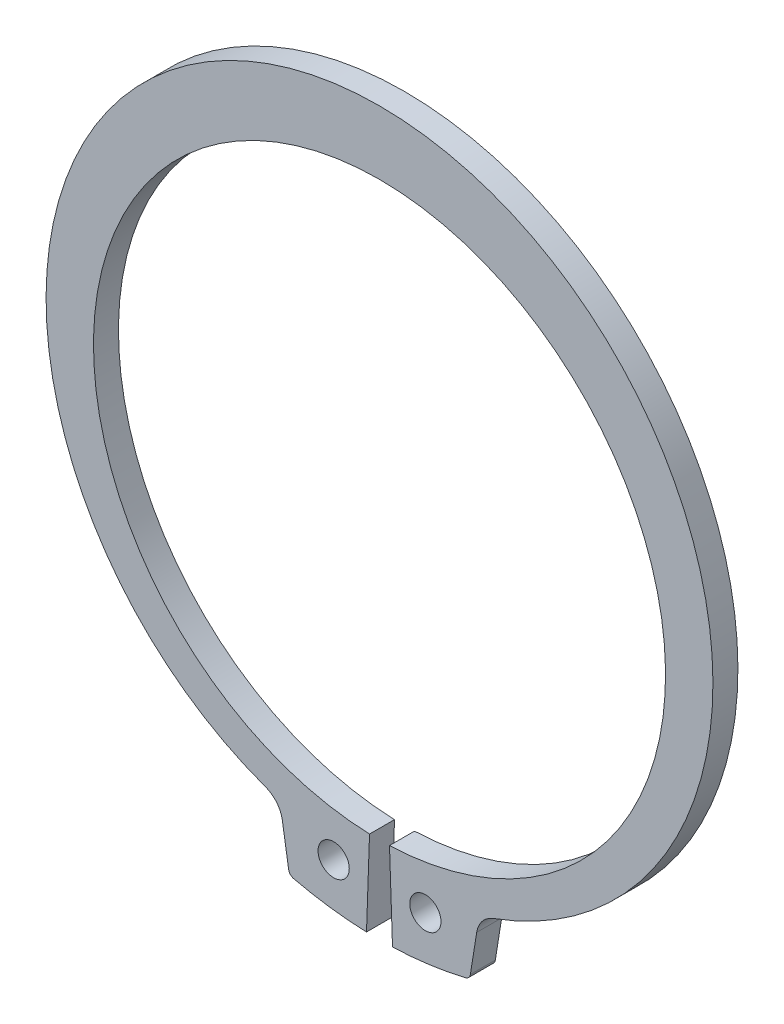
ISO-10303-21;
HEADER;
FILE_DESCRIPTION(('STEP AP214'),'2;1');
FILE_NAME('part.step','',(''),(''),'','','');
FILE_SCHEMA(('AUTOMOTIVE_DESIGN { 1 0 10303 214 1 1 1 1 }'));
ENDSEC;
DATA;
#1=APPLICATION_CONTEXT('core data for automotive mechanical design processes');
#2=APPLICATION_PROTOCOL_DEFINITION('international standard','automotive_design',2000,#1);
#3=PRODUCT_CONTEXT('',#1,'mechanical');
#4=PRODUCT('Part','Part','',(#3));
#5=PRODUCT_RELATED_PRODUCT_CATEGORY('part','',(#4));
#6=PRODUCT_DEFINITION_FORMATION('','',#4);
#7=PRODUCT_DEFINITION_CONTEXT('part definition',#1,'design');
#8=PRODUCT_DEFINITION('design','',#6,#7);
#9=PRODUCT_DEFINITION_SHAPE('','',#8);
#10=(LENGTH_UNIT() NAMED_UNIT(*) SI_UNIT(.MILLI.,.METRE.));
#11=(NAMED_UNIT(*) PLANE_ANGLE_UNIT() SI_UNIT($,.RADIAN.));
#12=(NAMED_UNIT(*) SI_UNIT($,.STERADIAN.) SOLID_ANGLE_UNIT());
#13=UNCERTAINTY_MEASURE_WITH_UNIT(LENGTH_MEASURE(1.E-05),#10,'distance_accuracy_value','');
#14=(GEOMETRIC_REPRESENTATION_CONTEXT(3) GLOBAL_UNCERTAINTY_ASSIGNED_CONTEXT((#13)) GLOBAL_UNIT_ASSIGNED_CONTEXT((#10,
#11,#12)) REPRESENTATION_CONTEXT('',''));
#15=CARTESIAN_POINT('',(0.,0.,0.));
#16=DIRECTION('',(0.,0.,1.));
#17=DIRECTION('',(1.,0.,0.));
#18=AXIS2_PLACEMENT_3D('',#15,#16,#17);
#19=CARTESIAN_POINT('',(0.,1.30636467058225,1.));
#20=DIRECTION('',(0.,0.,1.));
#21=DIRECTION('',(1.,0.,0.));
#22=AXIS2_PLACEMENT_3D('',#19,#20,#21);
#23=PLANE('',#22);
#24=DIRECTION('',(0.157739913212821,-0.987480693370565,0.));
#25=VECTOR('',#24,1.);
#26=CARTESIAN_POINT('',(-7.21841951119294,-28.9312521185108,1.));
#27=LINE('',#26,#25);
#28=CARTESIAN_POINT('',(-7.78010104623112,-25.4150230273701,1.));
#29=VERTEX_POINT('',#28);
#30=CARTESIAN_POINT('',(-7.27337825592786,-28.5872003293838,1.));
#31=VERTEX_POINT('',#30);
#32=EDGE_CURVE('E193',#29,#31,#27,.T.);
#33=ORIENTED_EDGE('',*,*,#32,.T.);
#34=CARTESIAN_POINT('',(-6.75603909880689,-28.5045607048385,1.));
#35=DIRECTION('',(0.,0.,1.));
#36=DIRECTION('',(1.,0.,0.));
#37=AXIS2_PLACEMENT_3D('',#34,#35,#36);
#38=CIRCLE('',#37,0.523897996785281);
#39=CARTESIAN_POINT('',(-6.87686394893013,-29.0143356224525,1.));
#40=VERTEX_POINT('',#39);
#41=EDGE_CURVE('E12',#31,#40,#38,.T.);
#42=ORIENTED_EDGE('',*,*,#41,.T.);
#43=CARTESIAN_POINT('',(0.,0.,1.));
#44=DIRECTION('',(0.,0.,1.));
#45=DIRECTION('',(1.,0.,0.));
#46=AXIS2_PLACEMENT_3D('',#43,#44,#45);
#47=CIRCLE('',#46,29.8181644201049);
#48=CARTESIAN_POINT('',(-1.04063893085413,-29.8,1.));
#49=VERTEX_POINT('',#48);
#50=EDGE_CURVE('E196',#40,#49,#47,.T.);
#51=ORIENTED_EDGE('',*,*,#50,.T.);
#52=DIRECTION('',(0.0348994967025035,0.999390827019096,0.));
#53=VECTOR('',#52,1.);
#54=CARTESIAN_POINT('',(-1.04063893085413,-29.8,1.));
#55=LINE('',#54,#53);
#56=CARTESIAN_POINT('',(-0.799198474487308,-22.8860499387373,1.));
#57=VERTEX_POINT('',#56);
#58=EDGE_CURVE('E198',#49,#57,#55,.T.);
#59=ORIENTED_EDGE('',*,*,#58,.T.);
#60=CARTESIAN_POINT('',(0.,0.,1.));
#61=DIRECTION('',(0.,0.,-1.));
#62=DIRECTION('',(1.,0.,0.));
#63=AXIS2_PLACEMENT_3D('',#60,#61,#62);
#64=CIRCLE('',#63,22.9);
#65=CARTESIAN_POINT('',(0.799198474487294,-22.8860499387373,1.));
#66=VERTEX_POINT('',#65);
#67=EDGE_CURVE('E152',#57,#66,#64,.T.);
#68=ORIENTED_EDGE('',*,*,#67,.T.);
#69=DIRECTION('',(-0.0348994967025028,0.999390827019096,0.));
#70=VECTOR('',#69,1.);
#71=CARTESIAN_POINT('',(1.04063893085411,-29.8,1.));
#72=LINE('',#71,#70);
#73=CARTESIAN_POINT('',(1.04063893085411,-29.8,1.));
#74=VERTEX_POINT('',#73);
#75=EDGE_CURVE('E132',#74,#66,#72,.T.);
#76=ORIENTED_EDGE('',*,*,#75,.F.);
#77=CARTESIAN_POINT('',(0.,0.,1.));
#78=DIRECTION('',(0.,0.,-1.));
#79=DIRECTION('',(-1.,0.,0.));
#80=AXIS2_PLACEMENT_3D('',#77,#78,#79);
#81=CIRCLE('',#80,29.8181644201049);
#82=CARTESIAN_POINT('',(6.87686394893011,-29.0143356224525,1.));
#83=VERTEX_POINT('',#82);
#84=EDGE_CURVE('E142',#83,#74,#81,.T.);
#85=ORIENTED_EDGE('',*,*,#84,.F.);
#86=CARTESIAN_POINT('',(6.75603909880687,-28.5045607048385,1.));
#87=DIRECTION('',(0.,0.,-1.));
#88=DIRECTION('',(-1.,0.,0.));
#89=AXIS2_PLACEMENT_3D('',#86,#87,#88);
#90=CIRCLE('',#89,0.523897996785281);
#91=CARTESIAN_POINT('',(7.27337825592785,-28.5872003293838,1.));
#92=VERTEX_POINT('',#91);
#93=EDGE_CURVE('E181',#92,#83,#90,.T.);
#94=ORIENTED_EDGE('',*,*,#93,.F.);
#95=DIRECTION('',(-0.157739913212822,-0.987480693370565,0.));
#96=VECTOR('',#95,1.);
#97=CARTESIAN_POINT('',(7.21841951119292,-28.9312521185108,1.));
#98=LINE('',#97,#96);
#99=CARTESIAN_POINT('',(7.7801010462311,-25.4150230273701,1.));
#100=VERTEX_POINT('',#99);
#101=EDGE_CURVE('E148',#100,#92,#98,.T.);
#102=ORIENTED_EDGE('',*,*,#101,.F.);
#103=CARTESIAN_POINT('',(9.84945767471502,-25.7455815255512,1.));
#104=DIRECTION('',(0.,0.,-1.));
#105=DIRECTION('',(-1.,0.,0.));
#106=AXIS2_PLACEMENT_3D('',#103,#104,#105);
#107=CIRCLE('',#106,2.09559198714112);
#108=CARTESIAN_POINT('',(9.13250739488078,-23.7764476873331,1.));
#109=VERTEX_POINT('',#108);
#110=EDGE_CURVE('E172',#109,#100,#107,.F.);
#111=ORIENTED_EDGE('',*,*,#110,.F.);
#112=CARTESIAN_POINT('',(0.,1.30636467058225,1.));
#113=DIRECTION('',(0.,0.,1.));
#114=DIRECTION('',(1.,0.,0.));
#115=AXIS2_PLACEMENT_3D('',#112,#113,#114);
#116=CIRCLE('',#115,26.6936353294178);
#117=CARTESIAN_POINT('',(-9.1325073948808,-23.7764476873331,1.));
#118=VERTEX_POINT('',#117);
#119=EDGE_CURVE('E190',#109,#118,#116,.T.);
#120=ORIENTED_EDGE('',*,*,#119,.T.);
#121=CARTESIAN_POINT('',(-9.84945767471504,-25.7455815255512,1.));
#122=DIRECTION('',(0.,0.,1.));
#123=DIRECTION('',(1.,0.,0.));
#124=AXIS2_PLACEMENT_3D('',#121,#122,#123);
#125=CIRCLE('',#124,2.09559198714112);
#126=EDGE_CURVE('E223',#118,#29,#125,.F.);
#127=ORIENTED_EDGE('',*,*,#126,.T.);
#128=EDGE_LOOP('',(#33,#42,#51,#59,#68,#76,#85,#94,#102,#111,#120,#127));
#129=FACE_BOUND('',#128,.T.);
#130=CARTESIAN_POINT('',(-3.67061913858102,-26.1022560345995,1.));
#131=DIRECTION('',(0.,0.,1.));
#132=DIRECTION('',(1.,0.,0.));
#133=AXIS2_PLACEMENT_3D('',#130,#131,#132);
#134=CIRCLE('',#133,1.25);
#135=CARTESIAN_POINT('',(-2.42061913858102,-26.1022560345995,1.));
#136=VERTEX_POINT('',#135);
#137=EDGE_CURVE('E184',#136,#136,#134,.T.);
#138=ORIENTED_EDGE('',*,*,#137,.F.);
#139=EDGE_LOOP('',(#138));
#140=FACE_BOUND('',#139,.T.);
#141=CARTESIAN_POINT('',(3.670619138581,-26.1022560345995,1.));
#142=DIRECTION('',(0.,0.,-1.));
#143=DIRECTION('',(-1.,0.,0.));
#144=AXIS2_PLACEMENT_3D('',#141,#142,#143);
#145=CIRCLE('',#144,1.25);
#146=CARTESIAN_POINT('',(2.420619138581,-26.1022560345995,1.));
#147=VERTEX_POINT('',#146);
#148=EDGE_CURVE('E162',#147,#147,#145,.T.);
#149=ORIENTED_EDGE('',*,*,#148,.T.);
#150=EDGE_LOOP('',(#149));
#151=FACE_BOUND('',#150,.T.);
#152=ADVANCED_FACE('F38',(#129,#140,#151),#23,.T.);
#153=CARTESIAN_POINT('',(0.,1.30636467058225,-1.));
#154=DIRECTION('',(0.,0.,1.));
#155=DIRECTION('',(1.,0.,0.));
#156=AXIS2_PLACEMENT_3D('',#153,#154,#155);
#157=PLANE('',#156);
#158=CARTESIAN_POINT('',(0.,0.,-1.));
#159=DIRECTION('',(0.,0.,1.));
#160=DIRECTION('',(1.,0.,0.));
#161=AXIS2_PLACEMENT_3D('',#158,#159,#160);
#162=CIRCLE('',#161,29.8181644201049);
#163=CARTESIAN_POINT('',(-6.87686394893013,-29.0143356224525,-1.));
#164=VERTEX_POINT('',#163);
#165=CARTESIAN_POINT('',(-1.04063893085413,-29.8,-1.));
#166=VERTEX_POINT('',#165);
#167=EDGE_CURVE('E206',#164,#166,#162,.T.);
#168=ORIENTED_EDGE('',*,*,#167,.F.);
#169=CARTESIAN_POINT('',(-6.75603909880689,-28.5045607048385,-1.));
#170=DIRECTION('',(0.,0.,1.));
#171=DIRECTION('',(1.,0.,0.));
#172=AXIS2_PLACEMENT_3D('',#169,#170,#171);
#173=CIRCLE('',#172,0.523897996785281);
#174=CARTESIAN_POINT('',(-7.27337825592786,-28.5872003293838,-1.));
#175=VERTEX_POINT('',#174);
#176=EDGE_CURVE('E60',#164,#175,#173,.F.);
#177=ORIENTED_EDGE('',*,*,#176,.T.);
#178=DIRECTION('',(0.157739913212821,-0.987480693370565,0.));
#179=VECTOR('',#178,1.);
#180=CARTESIAN_POINT('',(-7.21841951119294,-28.9312521185108,-1.));
#181=LINE('',#180,#179);
#182=CARTESIAN_POINT('',(-7.78010104623112,-25.4150230273701,-1.));
#183=VERTEX_POINT('',#182);
#184=EDGE_CURVE('E204',#183,#175,#181,.T.);
#185=ORIENTED_EDGE('',*,*,#184,.F.);
#186=CARTESIAN_POINT('',(-9.84945767471504,-25.7455815255512,-1.));
#187=DIRECTION('',(0.,0.,1.));
#188=DIRECTION('',(1.,0.,0.));
#189=AXIS2_PLACEMENT_3D('',#186,#187,#188);
#190=CIRCLE('',#189,2.09559198714112);
#191=CARTESIAN_POINT('',(-9.1325073948808,-23.7764476873331,-1.));
#192=VERTEX_POINT('',#191);
#193=EDGE_CURVE('E221',#183,#192,#190,.T.);
#194=ORIENTED_EDGE('',*,*,#193,.T.);
#195=CARTESIAN_POINT('',(0.,1.30636467058225,-1.));
#196=DIRECTION('',(0.,0.,1.));
#197=DIRECTION('',(1.,0.,0.));
#198=AXIS2_PLACEMENT_3D('',#195,#196,#197);
#199=CIRCLE('',#198,26.6936353294178);
#200=CARTESIAN_POINT('',(9.13250739488078,-23.7764476873331,-1.));
#201=VERTEX_POINT('',#200);
#202=EDGE_CURVE('E187',#201,#192,#199,.T.);
#203=ORIENTED_EDGE('',*,*,#202,.F.);
#204=CARTESIAN_POINT('',(9.84945767471502,-25.7455815255512,-1.));
#205=DIRECTION('',(0.,0.,-1.));
#206=DIRECTION('',(-1.,0.,0.));
#207=AXIS2_PLACEMENT_3D('',#204,#205,#206);
#208=CIRCLE('',#207,2.09559198714112);
#209=CARTESIAN_POINT('',(7.7801010462311,-25.4150230273701,-1.));
#210=VERTEX_POINT('',#209);
#211=EDGE_CURVE('E169',#210,#201,#208,.T.);
#212=ORIENTED_EDGE('',*,*,#211,.F.);
#213=DIRECTION('',(-0.157739913212822,-0.987480693370565,0.));
#214=VECTOR('',#213,1.);
#215=CARTESIAN_POINT('',(7.21841951119292,-28.9312521185108,-1.));
#216=LINE('',#215,#214);
#217=CARTESIAN_POINT('',(7.27337825592785,-28.5872003293838,-1.));
#218=VERTEX_POINT('',#217);
#219=EDGE_CURVE('E158',#210,#218,#216,.T.);
#220=ORIENTED_EDGE('',*,*,#219,.T.);
#221=CARTESIAN_POINT('',(6.75603909880687,-28.5045607048385,-1.));
#222=DIRECTION('',(0.,0.,-1.));
#223=DIRECTION('',(-1.,0.,0.));
#224=AXIS2_PLACEMENT_3D('',#221,#222,#223);
#225=CIRCLE('',#224,0.523897996785281);
#226=CARTESIAN_POINT('',(6.87686394893011,-29.0143356224525,-1.));
#227=VERTEX_POINT('',#226);
#228=EDGE_CURVE('E176',#227,#218,#225,.F.);
#229=ORIENTED_EDGE('',*,*,#228,.F.);
#230=CARTESIAN_POINT('',(0.,0.,-1.));
#231=DIRECTION('',(0.,0.,-1.));
#232=DIRECTION('',(-1.,0.,0.));
#233=AXIS2_PLACEMENT_3D('',#230,#231,#232);
#234=CIRCLE('',#233,29.8181644201049);
#235=CARTESIAN_POINT('',(1.04063893085411,-29.8,-1.));
#236=VERTEX_POINT('',#235);
#237=EDGE_CURVE('E161',#227,#236,#234,.T.);
#238=ORIENTED_EDGE('',*,*,#237,.T.);
#239=DIRECTION('',(-0.0348994967025028,0.999390827019096,0.));
#240=VECTOR('',#239,1.);
#241=CARTESIAN_POINT('',(1.04063893085411,-29.8,-1.));
#242=LINE('',#241,#240);
#243=CARTESIAN_POINT('',(0.799198474487294,-22.8860499387373,-1.));
#244=VERTEX_POINT('',#243);
#245=EDGE_CURVE('E134',#236,#244,#242,.T.);
#246=ORIENTED_EDGE('',*,*,#245,.T.);
#247=CARTESIAN_POINT('',(0.,0.,-1.));
#248=DIRECTION('',(0.,0.,-1.));
#249=DIRECTION('',(1.,0.,0.));
#250=AXIS2_PLACEMENT_3D('',#247,#248,#249);
#251=CIRCLE('',#250,22.9);
#252=CARTESIAN_POINT('',(-0.799198474487308,-22.8860499387373,-1.));
#253=VERTEX_POINT('',#252);
#254=EDGE_CURVE('E194',#253,#244,#251,.T.);
#255=ORIENTED_EDGE('',*,*,#254,.F.);
#256=DIRECTION('',(0.0348994967025035,0.999390827019096,0.));
#257=VECTOR('',#256,1.);
#258=CARTESIAN_POINT('',(-1.04063893085413,-29.8,-1.));
#259=LINE('',#258,#257);
#260=EDGE_CURVE('E208',#166,#253,#259,.T.);
#261=ORIENTED_EDGE('',*,*,#260,.F.);
#262=EDGE_LOOP('',(#168,#177,#185,#194,#203,#212,#220,#229,#238,#246,#255,#261));
#263=FACE_BOUND('',#262,.T.);
#264=CARTESIAN_POINT('',(-3.67061913858102,-26.1022560345995,-1.));
#265=DIRECTION('',(0.,0.,1.));
#266=DIRECTION('',(1.,0.,0.));
#267=AXIS2_PLACEMENT_3D('',#264,#265,#266);
#268=CIRCLE('',#267,1.25);
#269=CARTESIAN_POINT('',(-2.42061913858102,-26.1022560345995,-1.));
#270=VERTEX_POINT('',#269);
#271=EDGE_CURVE('E183',#270,#270,#268,.T.);
#272=ORIENTED_EDGE('',*,*,#271,.T.);
#273=EDGE_LOOP('',(#272));
#274=FACE_BOUND('',#273,.T.);
#275=CARTESIAN_POINT('',(3.670619138581,-26.1022560345995,-1.));
#276=DIRECTION('',(0.,0.,-1.));
#277=DIRECTION('',(-1.,0.,0.));
#278=AXIS2_PLACEMENT_3D('',#275,#276,#277);
#279=CIRCLE('',#278,1.25);
#280=CARTESIAN_POINT('',(2.420619138581,-26.1022560345995,-1.));
#281=VERTEX_POINT('',#280);
#282=EDGE_CURVE('E256',#281,#281,#279,.T.);
#283=ORIENTED_EDGE('',*,*,#282,.F.);
#284=EDGE_LOOP('',(#283));
#285=FACE_BOUND('',#284,.T.);
#286=ADVANCED_FACE('F236',(#263,#274,#285),#157,.F.);
#287=CARTESIAN_POINT('',(0.,1.30636467058225,1.));
#288=DIRECTION('',(0.,0.,-1.));
#289=DIRECTION('',(-1.,0.,0.));
#290=AXIS2_PLACEMENT_3D('',#287,#288,#289);
#291=CYLINDRICAL_SURFACE('',#290,26.6936353294178);
#292=ORIENTED_EDGE('',*,*,#202,.T.);
#293=DIRECTION('',(0.,0.,-1.));
#294=VECTOR('',#293,1.);
#295=CARTESIAN_POINT('',(-9.1325073948808,-23.7764476873331,1.));
#296=LINE('',#295,#294);
#297=EDGE_CURVE('E219',#192,#118,#296,.F.);
#298=ORIENTED_EDGE('',*,*,#297,.T.);
#299=ORIENTED_EDGE('',*,*,#119,.F.);
#300=DIRECTION('',(0.,0.,-1.));
#301=VECTOR('',#300,1.);
#302=CARTESIAN_POINT('',(9.13250739488078,-23.7764476873331,1.));
#303=LINE('',#302,#301);
#304=EDGE_CURVE('E166',#201,#109,#303,.F.);
#305=ORIENTED_EDGE('',*,*,#304,.F.);
#306=EDGE_LOOP('',(#292,#298,#299,#305));
#307=FACE_BOUND('',#306,.T.);
#308=ADVANCED_FACE('F271',(#307),#291,.T.);
#309=CARTESIAN_POINT('',(-7.21841951119294,-28.9312521185108,1.));
#310=DIRECTION('',(0.987480693370565,0.157739913212821,0.));
#311=DIRECTION('',(-0.157739913212821,0.987480693370565,0.));
#312=AXIS2_PLACEMENT_3D('',#309,#310,#311);
#313=PLANE('',#312);
#314=ORIENTED_EDGE('',*,*,#184,.T.);
#315=DIRECTION('',(0.,0.,-1.));
#316=VECTOR('',#315,1.);
#317=CARTESIAN_POINT('',(-7.27337825592786,-28.5872003293838,1.));
#318=LINE('',#317,#316);
#319=EDGE_CURVE('E46',#175,#31,#318,.F.);
#320=ORIENTED_EDGE('',*,*,#319,.T.);
#321=ORIENTED_EDGE('',*,*,#32,.F.);
#322=DIRECTION('',(0.,0.,1.));
#323=VECTOR('',#322,1.);
#324=CARTESIAN_POINT('',(-7.78010104623112,-25.4150230273701,-1.));
#325=LINE('',#324,#323);
#326=EDGE_CURVE('E216',#29,#183,#325,.F.);
#327=ORIENTED_EDGE('',*,*,#326,.T.);
#328=EDGE_LOOP('',(#314,#320,#321,#327));
#329=FACE_BOUND('',#328,.T.);
#330=ADVANCED_FACE('F277',(#329),#313,.F.);
#331=CARTESIAN_POINT('',(0.,0.,1.));
#332=DIRECTION('',(0.,0.,-1.));
#333=DIRECTION('',(-1.,0.,0.));
#334=AXIS2_PLACEMENT_3D('',#331,#332,#333);
#335=CYLINDRICAL_SURFACE('',#334,29.8181644201049);
#336=ORIENTED_EDGE('',*,*,#50,.F.);
#337=DIRECTION('',(0.,0.,-1.));
#338=VECTOR('',#337,1.);
#339=CARTESIAN_POINT('',(-6.87686394893013,-29.0143356224525,1.));
#340=LINE('',#339,#338);
#341=EDGE_CURVE('E225',#40,#164,#340,.T.);
#342=ORIENTED_EDGE('',*,*,#341,.T.);
#343=ORIENTED_EDGE('',*,*,#167,.T.);
#344=DIRECTION('',(0.,0.,-1.));
#345=VECTOR('',#344,1.);
#346=CARTESIAN_POINT('',(-1.04063893085413,-29.8,1.));
#347=LINE('',#346,#345);
#348=EDGE_CURVE('E213',#49,#166,#347,.T.);
#349=ORIENTED_EDGE('',*,*,#348,.F.);
#350=EDGE_LOOP('',(#336,#342,#343,#349));
#351=FACE_BOUND('',#350,.T.);
#352=ADVANCED_FACE('F231',(#351),#335,.T.);
#353=CARTESIAN_POINT('',(-1.04063893085413,-29.8,1.));
#354=DIRECTION('',(-0.999390827019096,0.0348994967025035,0.));
#355=DIRECTION('',(-0.0348994967025035,-0.999390827019096,0.));
#356=AXIS2_PLACEMENT_3D('',#353,#354,#355);
#357=PLANE('',#356);
#358=ORIENTED_EDGE('',*,*,#260,.T.);
#359=DIRECTION('',(0.,0.,-1.));
#360=VECTOR('',#359,1.);
#361=CARTESIAN_POINT('',(-0.799198474487308,-22.8860499387373,1.));
#362=LINE('',#361,#360);
#363=EDGE_CURVE('E201',#57,#253,#362,.T.);
#364=ORIENTED_EDGE('',*,*,#363,.F.);
#365=ORIENTED_EDGE('',*,*,#58,.F.);
#366=ORIENTED_EDGE('',*,*,#348,.T.);
#367=EDGE_LOOP('',(#358,#364,#365,#366));
#368=FACE_BOUND('',#367,.T.);
#369=ADVANCED_FACE('F241',(#368),#357,.F.);
#370=CARTESIAN_POINT('',(0.,0.,1.));
#371=DIRECTION('',(0.,0.,-1.));
#372=DIRECTION('',(-1.,0.,0.));
#373=AXIS2_PLACEMENT_3D('',#370,#371,#372);
#374=CYLINDRICAL_SURFACE('',#373,22.9);
#375=ORIENTED_EDGE('',*,*,#254,.T.);
#376=DIRECTION('',(0.,0.,-1.));
#377=VECTOR('',#376,1.);
#378=CARTESIAN_POINT('',(0.799198474487294,-22.8860499387373,1.));
#379=LINE('',#378,#377);
#380=EDGE_CURVE('E139',#66,#244,#379,.T.);
#381=ORIENTED_EDGE('',*,*,#380,.F.);
#382=ORIENTED_EDGE('',*,*,#67,.F.);
#383=ORIENTED_EDGE('',*,*,#363,.T.);
#384=EDGE_LOOP('',(#375,#381,#382,#383));
#385=FACE_BOUND('',#384,.T.);
#386=ADVANCED_FACE('F244',(#385),#374,.F.);
#387=CARTESIAN_POINT('',(-3.67061913858102,-26.1022560345995,1.));
#388=DIRECTION('',(0.,0.,-1.));
#389=DIRECTION('',(-1.,0.,0.));
#390=AXIS2_PLACEMENT_3D('',#387,#388,#389);
#391=CYLINDRICAL_SURFACE('',#390,1.25);
#392=ORIENTED_EDGE('',*,*,#137,.T.);
#393=EDGE_LOOP('',(#392));
#394=FACE_BOUND('',#393,.T.);
#395=ORIENTED_EDGE('',*,*,#271,.F.);
#396=EDGE_LOOP('',(#395));
#397=FACE_BOUND('',#396,.T.);
#398=ADVANCED_FACE('F285',(#394,#397),#391,.F.);
#399=CARTESIAN_POINT('',(-9.84945767471504,-25.7455815255512,1.));
#400=DIRECTION('',(0.,0.,-1.));
#401=DIRECTION('',(-1.,0.,0.));
#402=AXIS2_PLACEMENT_3D('',#399,#400,#401);
#403=CYLINDRICAL_SURFACE('',#402,2.09559198714112);
#404=ORIENTED_EDGE('',*,*,#126,.F.);
#405=ORIENTED_EDGE('',*,*,#297,.F.);
#406=ORIENTED_EDGE('',*,*,#193,.F.);
#407=ORIENTED_EDGE('',*,*,#326,.F.);
#408=EDGE_LOOP('',(#404,#405,#406,#407));
#409=FACE_BOUND('',#408,.T.);
#410=ADVANCED_FACE('F291',(#409),#403,.F.);
#411=CARTESIAN_POINT('',(-6.75603909880689,-28.5045607048385,1.));
#412=DIRECTION('',(0.,0.,-1.));
#413=DIRECTION('',(-1.,0.,0.));
#414=AXIS2_PLACEMENT_3D('',#411,#412,#413);
#415=CYLINDRICAL_SURFACE('',#414,0.523897996785281);
#416=ORIENTED_EDGE('',*,*,#41,.F.);
#417=ORIENTED_EDGE('',*,*,#319,.F.);
#418=ORIENTED_EDGE('',*,*,#176,.F.);
#419=ORIENTED_EDGE('',*,*,#341,.F.);
#420=EDGE_LOOP('',(#416,#417,#418,#419));
#421=FACE_BOUND('',#420,.T.);
#422=ADVANCED_FACE('F40',(#421),#415,.T.);
#423=CARTESIAN_POINT('',(7.21841951119292,-28.9312521185108,1.));
#424=DIRECTION('',(-0.987480693370565,0.157739913212822,0.));
#425=DIRECTION('',(0.157739913212822,0.987480693370565,0.));
#426=AXIS2_PLACEMENT_3D('',#423,#424,#425);
#427=PLANE('',#426);
#428=ORIENTED_EDGE('',*,*,#219,.F.);
#429=DIRECTION('',(0.,0.,1.));
#430=VECTOR('',#429,1.);
#431=CARTESIAN_POINT('',(7.7801010462311,-25.4150230273701,-1.));
#432=LINE('',#431,#430);
#433=EDGE_CURVE('E138',#100,#210,#432,.F.);
#434=ORIENTED_EDGE('',*,*,#433,.F.);
#435=ORIENTED_EDGE('',*,*,#101,.T.);
#436=DIRECTION('',(0.,0.,-1.));
#437=VECTOR('',#436,1.);
#438=CARTESIAN_POINT('',(7.27337825592785,-28.5872003293838,1.));
#439=LINE('',#438,#437);
#440=EDGE_CURVE('E179',#218,#92,#439,.F.);
#441=ORIENTED_EDGE('',*,*,#440,.F.);
#442=EDGE_LOOP('',(#428,#434,#435,#441));
#443=FACE_BOUND('',#442,.T.);
#444=ADVANCED_FACE('F254',(#443),#427,.F.);
#445=CARTESIAN_POINT('',(0.,0.,1.));
#446=DIRECTION('',(0.,0.,-1.));
#447=DIRECTION('',(1.,0.,0.));
#448=AXIS2_PLACEMENT_3D('',#445,#446,#447);
#449=CYLINDRICAL_SURFACE('',#448,29.8181644201049);
#450=ORIENTED_EDGE('',*,*,#84,.T.);
#451=DIRECTION('',(0.,0.,-1.));
#452=VECTOR('',#451,1.);
#453=CARTESIAN_POINT('',(1.04063893085411,-29.8,1.));
#454=LINE('',#453,#452);
#455=EDGE_CURVE('E127',#74,#236,#454,.T.);
#456=ORIENTED_EDGE('',*,*,#455,.T.);
#457=ORIENTED_EDGE('',*,*,#237,.F.);
#458=DIRECTION('',(0.,0.,-1.));
#459=VECTOR('',#458,1.);
#460=CARTESIAN_POINT('',(6.87686394893011,-29.0143356224525,1.));
#461=LINE('',#460,#459);
#462=EDGE_CURVE('E144',#83,#227,#461,.T.);
#463=ORIENTED_EDGE('',*,*,#462,.F.);
#464=EDGE_LOOP('',(#450,#456,#457,#463));
#465=FACE_BOUND('',#464,.T.);
#466=ADVANCED_FACE('F143',(#465),#449,.T.);
#467=CARTESIAN_POINT('',(1.04063893085411,-29.8,1.));
#468=DIRECTION('',(0.999390827019096,0.0348994967025028,0.));
#469=DIRECTION('',(0.0348994967025028,-0.999390827019096,0.));
#470=AXIS2_PLACEMENT_3D('',#467,#468,#469);
#471=PLANE('',#470);
#472=ORIENTED_EDGE('',*,*,#245,.F.);
#473=ORIENTED_EDGE('',*,*,#455,.F.);
#474=ORIENTED_EDGE('',*,*,#75,.T.);
#475=ORIENTED_EDGE('',*,*,#380,.T.);
#476=EDGE_LOOP('',(#472,#473,#474,#475));
#477=FACE_BOUND('',#476,.T.);
#478=ADVANCED_FACE('F129',(#477),#471,.F.);
#479=CARTESIAN_POINT('',(3.670619138581,-26.1022560345995,1.));
#480=DIRECTION('',(0.,0.,-1.));
#481=DIRECTION('',(1.,0.,0.));
#482=AXIS2_PLACEMENT_3D('',#479,#480,#481);
#483=CYLINDRICAL_SURFACE('',#482,1.25);
#484=ORIENTED_EDGE('',*,*,#148,.F.);
#485=EDGE_LOOP('',(#484));
#486=FACE_BOUND('',#485,.T.);
#487=ORIENTED_EDGE('',*,*,#282,.T.);
#488=EDGE_LOOP('',(#487));
#489=FACE_BOUND('',#488,.T.);
#490=ADVANCED_FACE('F263',(#486,#489),#483,.F.);
#491=CARTESIAN_POINT('',(9.84945767471502,-25.7455815255512,1.));
#492=DIRECTION('',(0.,0.,-1.));
#493=DIRECTION('',(1.,0.,0.));
#494=AXIS2_PLACEMENT_3D('',#491,#492,#493);
#495=CYLINDRICAL_SURFACE('',#494,2.09559198714112);
#496=ORIENTED_EDGE('',*,*,#110,.T.);
#497=ORIENTED_EDGE('',*,*,#433,.T.);
#498=ORIENTED_EDGE('',*,*,#211,.T.);
#499=ORIENTED_EDGE('',*,*,#304,.T.);
#500=EDGE_LOOP('',(#496,#497,#498,#499));
#501=FACE_BOUND('',#500,.T.);
#502=ADVANCED_FACE('F266',(#501),#495,.F.);
#503=CARTESIAN_POINT('',(6.75603909880687,-28.5045607048385,1.));
#504=DIRECTION('',(0.,0.,-1.));
#505=DIRECTION('',(1.,0.,0.));
#506=AXIS2_PLACEMENT_3D('',#503,#504,#505);
#507=CYLINDRICAL_SURFACE('',#506,0.523897996785281);
#508=ORIENTED_EDGE('',*,*,#93,.T.);
#509=ORIENTED_EDGE('',*,*,#462,.T.);
#510=ORIENTED_EDGE('',*,*,#228,.T.);
#511=ORIENTED_EDGE('',*,*,#440,.T.);
#512=EDGE_LOOP('',(#508,#509,#510,#511));
#513=FACE_BOUND('',#512,.T.);
#514=ADVANCED_FACE('F249',(#513),#507,.T.);
#515=CLOSED_SHELL('',(#152,#286,#308,#330,#352,#369,#386,#398,#410,#422,#444,#466,#478,#490,
#502,#514));
#516=MANIFOLD_SOLID_BREP('B2',#515);
#517=ADVANCED_BREP_SHAPE_REPRESENTATION('',(#18,#516),#14);
#518=SHAPE_DEFINITION_REPRESENTATION(#9,#517);
ENDSEC;
END-ISO-10303-21;
